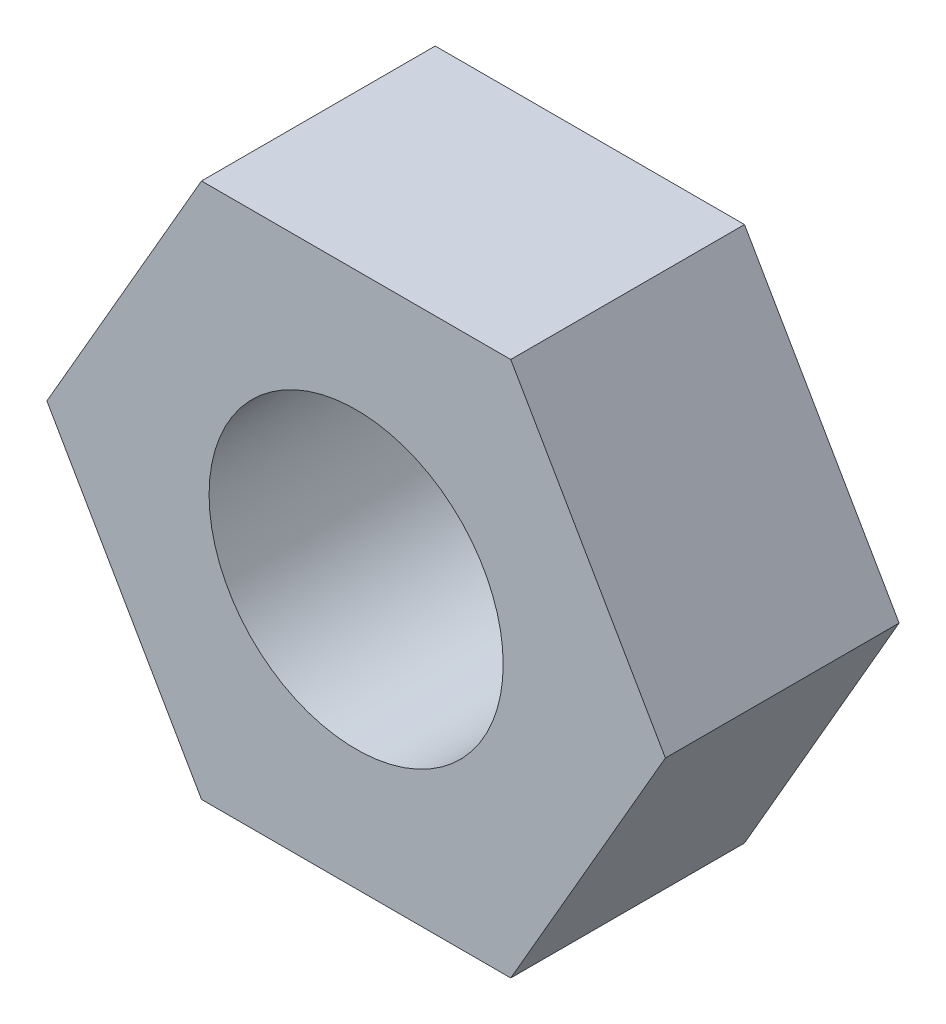
ISO-10303-21;
HEADER;
FILE_DESCRIPTION(('STEP AP214'),'2;1');
FILE_NAME('part.step','',(''),(''),'','','');
FILE_SCHEMA(('AUTOMOTIVE_DESIGN { 1 0 10303 214 1 1 1 1 }'));
ENDSEC;
DATA;
#1=APPLICATION_CONTEXT('core data for automotive mechanical design processes');
#2=APPLICATION_PROTOCOL_DEFINITION('international standard','automotive_design',2000,#1);
#3=PRODUCT_CONTEXT('',#1,'mechanical');
#4=PRODUCT('Part','Part','',(#3));
#5=PRODUCT_RELATED_PRODUCT_CATEGORY('part','',(#4));
#6=PRODUCT_DEFINITION_FORMATION('','',#4);
#7=PRODUCT_DEFINITION_CONTEXT('part definition',#1,'design');
#8=PRODUCT_DEFINITION('design','',#6,#7);
#9=PRODUCT_DEFINITION_SHAPE('','',#8);
#10=(LENGTH_UNIT() NAMED_UNIT(*) SI_UNIT(.MILLI.,.METRE.));
#11=(NAMED_UNIT(*) PLANE_ANGLE_UNIT() SI_UNIT($,.RADIAN.));
#12=(NAMED_UNIT(*) SI_UNIT($,.STERADIAN.) SOLID_ANGLE_UNIT());
#13=UNCERTAINTY_MEASURE_WITH_UNIT(LENGTH_MEASURE(1.E-05),#10,'distance_accuracy_value','');
#14=(GEOMETRIC_REPRESENTATION_CONTEXT(3) GLOBAL_UNCERTAINTY_ASSIGNED_CONTEXT((#13)) GLOBAL_UNIT_ASSIGNED_CONTEXT((#10,
#11,#12)) REPRESENTATION_CONTEXT('',''));
#15=CARTESIAN_POINT('',(0.,0.,0.));
#16=DIRECTION('',(0.,0.,1.));
#17=DIRECTION('',(1.,0.,0.));
#18=AXIS2_PLACEMENT_3D('',#15,#16,#17);
#19=CARTESIAN_POINT('',(0.,0.,2.4));
#20=DIRECTION('',(0.,0.,1.));
#21=DIRECTION('',(1.,0.,0.));
#22=AXIS2_PLACEMENT_3D('',#19,#20,#21);
#23=PLANE('',#22);
#24=DIRECTION('',(0.5,0.866025403784439,0.));
#25=VECTOR('',#24,1.);
#26=CARTESIAN_POINT('',(1.58771324027147,-2.75,2.4));
#27=LINE('',#26,#25);
#28=CARTESIAN_POINT('',(1.58771324027147,-2.75,2.4));
#29=VERTEX_POINT('',#28);
#30=CARTESIAN_POINT('',(3.17542648054294,0.,2.4));
#31=VERTEX_POINT('',#30);
#32=EDGE_CURVE('E141',#29,#31,#27,.T.);
#33=ORIENTED_EDGE('',*,*,#32,.T.);
#34=DIRECTION('',(-0.5,0.866025403784439,0.));
#35=VECTOR('',#34,1.);
#36=CARTESIAN_POINT('',(3.17542648054294,0.,2.4));
#37=LINE('',#36,#35);
#38=CARTESIAN_POINT('',(1.58771324027147,2.75,2.4));
#39=VERTEX_POINT('',#38);
#40=EDGE_CURVE('E101',#31,#39,#37,.T.);
#41=ORIENTED_EDGE('',*,*,#40,.T.);
#42=DIRECTION('',(-1.,0.,0.));
#43=VECTOR('',#42,1.);
#44=CARTESIAN_POINT('',(1.58771324027147,2.75,2.4));
#45=LINE('',#44,#43);
#46=CARTESIAN_POINT('',(-1.58771324027147,2.75,2.4));
#47=VERTEX_POINT('',#46);
#48=EDGE_CURVE('E111',#39,#47,#45,.T.);
#49=ORIENTED_EDGE('',*,*,#48,.T.);
#50=DIRECTION('',(-0.5,-0.866025403784438,0.));
#51=VECTOR('',#50,1.);
#52=CARTESIAN_POINT('',(-1.58771324027147,2.75,2.4));
#53=LINE('',#52,#51);
#54=CARTESIAN_POINT('',(-3.17542648054294,0.,2.4));
#55=VERTEX_POINT('',#54);
#56=EDGE_CURVE('E107',#47,#55,#53,.T.);
#57=ORIENTED_EDGE('',*,*,#56,.T.);
#58=DIRECTION('',(0.5,-0.866025403784439,0.));
#59=VECTOR('',#58,1.);
#60=CARTESIAN_POINT('',(-3.17542648054294,0.,2.4));
#61=LINE('',#60,#59);
#62=CARTESIAN_POINT('',(-1.58771324027147,-2.75,2.4));
#63=VERTEX_POINT('',#62);
#64=EDGE_CURVE('E115',#55,#63,#61,.T.);
#65=ORIENTED_EDGE('',*,*,#64,.T.);
#66=DIRECTION('',(1.,0.,0.));
#67=VECTOR('',#66,1.);
#68=CARTESIAN_POINT('',(-1.58771324027147,-2.75,2.4));
#69=LINE('',#68,#67);
#70=EDGE_CURVE('E65',#63,#29,#69,.T.);
#71=ORIENTED_EDGE('',*,*,#70,.T.);
#72=EDGE_LOOP('',(#33,#41,#49,#57,#65,#71));
#73=FACE_BOUND('',#72,.T.);
#74=CARTESIAN_POINT('',(0.,0.,2.4));
#75=DIRECTION('',(0.,0.,1.));
#76=DIRECTION('',(1.,0.,0.));
#77=AXIS2_PLACEMENT_3D('',#74,#75,#76);
#78=CIRCLE('',#77,1.51);
#79=CARTESIAN_POINT('',(1.51,0.,2.4));
#80=VERTEX_POINT('',#79);
#81=EDGE_CURVE('E136',#80,#80,#78,.T.);
#82=ORIENTED_EDGE('',*,*,#81,.F.);
#83=EDGE_LOOP('',(#82));
#84=FACE_BOUND('',#83,.T.);
#85=ADVANCED_FACE('F50',(#73,#84),#23,.T.);
#86=CARTESIAN_POINT('',(0.,0.,0.));
#87=DIRECTION('',(0.,0.,1.));
#88=DIRECTION('',(1.,0.,0.));
#89=AXIS2_PLACEMENT_3D('',#86,#87,#88);
#90=PLANE('',#89);
#91=DIRECTION('',(0.5,0.866025403784439,0.));
#92=VECTOR('',#91,1.);
#93=CARTESIAN_POINT('',(1.58771324027147,-2.75,0.));
#94=LINE('',#93,#92);
#95=CARTESIAN_POINT('',(1.58771324027147,-2.75,0.));
#96=VERTEX_POINT('',#95);
#97=CARTESIAN_POINT('',(3.17542648054294,0.,0.));
#98=VERTEX_POINT('',#97);
#99=EDGE_CURVE('E134',#96,#98,#94,.T.);
#100=ORIENTED_EDGE('',*,*,#99,.F.);
#101=DIRECTION('',(1.,0.,0.));
#102=VECTOR('',#101,1.);
#103=CARTESIAN_POINT('',(-1.58771324027147,-2.75,0.));
#104=LINE('',#103,#102);
#105=CARTESIAN_POINT('',(-1.58771324027147,-2.75,0.));
#106=VERTEX_POINT('',#105);
#107=EDGE_CURVE('E91',#106,#96,#104,.T.);
#108=ORIENTED_EDGE('',*,*,#107,.F.);
#109=DIRECTION('',(0.5,-0.866025403784439,0.));
#110=VECTOR('',#109,1.);
#111=CARTESIAN_POINT('',(-3.17542648054294,0.,0.));
#112=LINE('',#111,#110);
#113=CARTESIAN_POINT('',(-3.17542648054294,0.,0.));
#114=VERTEX_POINT('',#113);
#115=EDGE_CURVE('E87',#114,#106,#112,.T.);
#116=ORIENTED_EDGE('',*,*,#115,.F.);
#117=DIRECTION('',(-0.5,-0.866025403784438,0.));
#118=VECTOR('',#117,1.);
#119=CARTESIAN_POINT('',(-1.58771324027147,2.75,0.));
#120=LINE('',#119,#118);
#121=CARTESIAN_POINT('',(-1.58771324027147,2.75,0.));
#122=VERTEX_POINT('',#121);
#123=EDGE_CURVE('E125',#122,#114,#120,.T.);
#124=ORIENTED_EDGE('',*,*,#123,.F.);
#125=DIRECTION('',(-1.,0.,0.));
#126=VECTOR('',#125,1.);
#127=CARTESIAN_POINT('',(1.58771324027147,2.75,0.));
#128=LINE('',#127,#126);
#129=CARTESIAN_POINT('',(1.58771324027147,2.75,0.));
#130=VERTEX_POINT('',#129);
#131=EDGE_CURVE('E137',#130,#122,#128,.T.);
#132=ORIENTED_EDGE('',*,*,#131,.F.);
#133=DIRECTION('',(-0.5,0.866025403784439,0.));
#134=VECTOR('',#133,1.);
#135=CARTESIAN_POINT('',(3.17542648054294,0.,0.));
#136=LINE('',#135,#134);
#137=EDGE_CURVE('E131',#98,#130,#136,.T.);
#138=ORIENTED_EDGE('',*,*,#137,.F.);
#139=EDGE_LOOP('',(#100,#108,#116,#124,#132,#138));
#140=FACE_BOUND('',#139,.T.);
#141=CARTESIAN_POINT('',(0.,0.,0.));
#142=DIRECTION('',(0.,0.,1.));
#143=DIRECTION('',(1.,0.,0.));
#144=AXIS2_PLACEMENT_3D('',#141,#142,#143);
#145=CIRCLE('',#144,1.51);
#146=CARTESIAN_POINT('',(1.51,0.,0.));
#147=VERTEX_POINT('',#146);
#148=EDGE_CURVE('E289',#147,#147,#145,.T.);
#149=ORIENTED_EDGE('',*,*,#148,.T.);
#150=EDGE_LOOP('',(#149));
#151=FACE_BOUND('',#150,.T.);
#152=ADVANCED_FACE('F155',(#140,#151),#90,.F.);
#153=CARTESIAN_POINT('',(1.58771324027147,-2.75,2.4));
#154=DIRECTION('',(-0.866025403784439,0.5,0.));
#155=DIRECTION('',(-0.5,-0.866025403784439,0.));
#156=AXIS2_PLACEMENT_3D('',#153,#154,#155);
#157=PLANE('',#156);
#158=ORIENTED_EDGE('',*,*,#99,.T.);
#159=DIRECTION('',(0.,0.,-1.));
#160=VECTOR('',#159,1.);
#161=CARTESIAN_POINT('',(3.17542648054294,0.,2.4));
#162=LINE('',#161,#160);
#163=EDGE_CURVE('E11',#31,#98,#162,.T.);
#164=ORIENTED_EDGE('',*,*,#163,.F.);
#165=ORIENTED_EDGE('',*,*,#32,.F.);
#166=DIRECTION('',(0.,0.,-1.));
#167=VECTOR('',#166,1.);
#168=CARTESIAN_POINT('',(1.58771324027147,-2.75,2.4));
#169=LINE('',#168,#167);
#170=EDGE_CURVE('E126',#29,#96,#169,.T.);
#171=ORIENTED_EDGE('',*,*,#170,.T.);
#172=EDGE_LOOP('',(#158,#164,#165,#171));
#173=FACE_BOUND('',#172,.T.);
#174=ADVANCED_FACE('F47',(#173),#157,.F.);
#175=CARTESIAN_POINT('',(3.17542648054294,0.,2.4));
#176=DIRECTION('',(-0.866025403784439,-0.5,0.));
#177=DIRECTION('',(0.5,-0.866025403784439,0.));
#178=AXIS2_PLACEMENT_3D('',#175,#176,#177);
#179=PLANE('',#178);
#180=ORIENTED_EDGE('',*,*,#137,.T.);
#181=DIRECTION('',(0.,0.,-1.));
#182=VECTOR('',#181,1.);
#183=CARTESIAN_POINT('',(1.58771324027147,2.75,2.4));
#184=LINE('',#183,#182);
#185=EDGE_CURVE('E57',#39,#130,#184,.T.);
#186=ORIENTED_EDGE('',*,*,#185,.F.);
#187=ORIENTED_EDGE('',*,*,#40,.F.);
#188=ORIENTED_EDGE('',*,*,#163,.T.);
#189=EDGE_LOOP('',(#180,#186,#187,#188));
#190=FACE_BOUND('',#189,.T.);
#191=ADVANCED_FACE('F180',(#190),#179,.F.);
#192=CARTESIAN_POINT('',(1.58771324027147,2.75,2.4));
#193=DIRECTION('',(0.,-1.,0.));
#194=DIRECTION('',(1.,0.,0.));
#195=AXIS2_PLACEMENT_3D('',#192,#193,#194);
#196=PLANE('',#195);
#197=ORIENTED_EDGE('',*,*,#131,.T.);
#198=DIRECTION('',(0.,0.,-1.));
#199=VECTOR('',#198,1.);
#200=CARTESIAN_POINT('',(-1.58771324027147,2.75,2.4));
#201=LINE('',#200,#199);
#202=EDGE_CURVE('E122',#47,#122,#201,.T.);
#203=ORIENTED_EDGE('',*,*,#202,.F.);
#204=ORIENTED_EDGE('',*,*,#48,.F.);
#205=ORIENTED_EDGE('',*,*,#185,.T.);
#206=EDGE_LOOP('',(#197,#203,#204,#205));
#207=FACE_BOUND('',#206,.T.);
#208=ADVANCED_FACE('F149',(#207),#196,.F.);
#209=CARTESIAN_POINT('',(-1.58771324027147,2.75,2.4));
#210=DIRECTION('',(0.866025403784439,-0.5,0.));
#211=DIRECTION('',(0.5,0.866025403784439,0.));
#212=AXIS2_PLACEMENT_3D('',#209,#210,#211);
#213=PLANE('',#212);
#214=ORIENTED_EDGE('',*,*,#123,.T.);
#215=DIRECTION('',(0.,0.,-1.));
#216=VECTOR('',#215,1.);
#217=CARTESIAN_POINT('',(-3.17542648054294,0.,2.4));
#218=LINE('',#217,#216);
#219=EDGE_CURVE('E120',#55,#114,#218,.T.);
#220=ORIENTED_EDGE('',*,*,#219,.F.);
#221=ORIENTED_EDGE('',*,*,#56,.F.);
#222=ORIENTED_EDGE('',*,*,#202,.T.);
#223=EDGE_LOOP('',(#214,#220,#221,#222));
#224=FACE_BOUND('',#223,.T.);
#225=ADVANCED_FACE('F116',(#224),#213,.F.);
#226=CARTESIAN_POINT('',(-3.17542648054294,0.,2.4));
#227=DIRECTION('',(0.866025403784439,0.5,0.));
#228=DIRECTION('',(-0.5,0.866025403784439,0.));
#229=AXIS2_PLACEMENT_3D('',#226,#227,#228);
#230=PLANE('',#229);
#231=ORIENTED_EDGE('',*,*,#115,.T.);
#232=DIRECTION('',(0.,0.,-1.));
#233=VECTOR('',#232,1.);
#234=CARTESIAN_POINT('',(-1.58771324027147,-2.75,2.4));
#235=LINE('',#234,#233);
#236=EDGE_CURVE('E123',#63,#106,#235,.T.);
#237=ORIENTED_EDGE('',*,*,#236,.F.);
#238=ORIENTED_EDGE('',*,*,#64,.F.);
#239=ORIENTED_EDGE('',*,*,#219,.T.);
#240=EDGE_LOOP('',(#231,#237,#238,#239));
#241=FACE_BOUND('',#240,.T.);
#242=ADVANCED_FACE('F127',(#241),#230,.F.);
#243=CARTESIAN_POINT('',(-1.58771324027147,-2.75,2.4));
#244=DIRECTION('',(0.,1.,0.));
#245=DIRECTION('',(-1.,0.,0.));
#246=AXIS2_PLACEMENT_3D('',#243,#244,#245);
#247=PLANE('',#246);
#248=ORIENTED_EDGE('',*,*,#107,.T.);
#249=ORIENTED_EDGE('',*,*,#170,.F.);
#250=ORIENTED_EDGE('',*,*,#70,.F.);
#251=ORIENTED_EDGE('',*,*,#236,.T.);
#252=EDGE_LOOP('',(#248,#249,#250,#251));
#253=FACE_BOUND('',#252,.T.);
#254=ADVANCED_FACE('F160',(#253),#247,.F.);
#255=CARTESIAN_POINT('',(0.,0.,2.4));
#256=DIRECTION('',(0.,0.,-1.));
#257=DIRECTION('',(-1.,0.,0.));
#258=AXIS2_PLACEMENT_3D('',#255,#256,#257);
#259=CYLINDRICAL_SURFACE('',#258,1.51);
#260=ORIENTED_EDGE('',*,*,#81,.T.);
#261=EDGE_LOOP('',(#260));
#262=FACE_BOUND('',#261,.T.);
#263=ORIENTED_EDGE('',*,*,#148,.F.);
#264=EDGE_LOOP('',(#263));
#265=FACE_BOUND('',#264,.T.);
#266=ADVANCED_FACE('F157',(#262,#265),#259,.F.);
#267=CLOSED_SHELL('',(#85,#152,#174,#191,#208,#225,#242,#254,#266));
#268=MANIFOLD_SOLID_BREP('B2',#267);
#269=ADVANCED_BREP_SHAPE_REPRESENTATION('',(#18,#268),#14);
#270=SHAPE_DEFINITION_REPRESENTATION(#9,#269);
ENDSEC;
END-ISO-10303-21;
